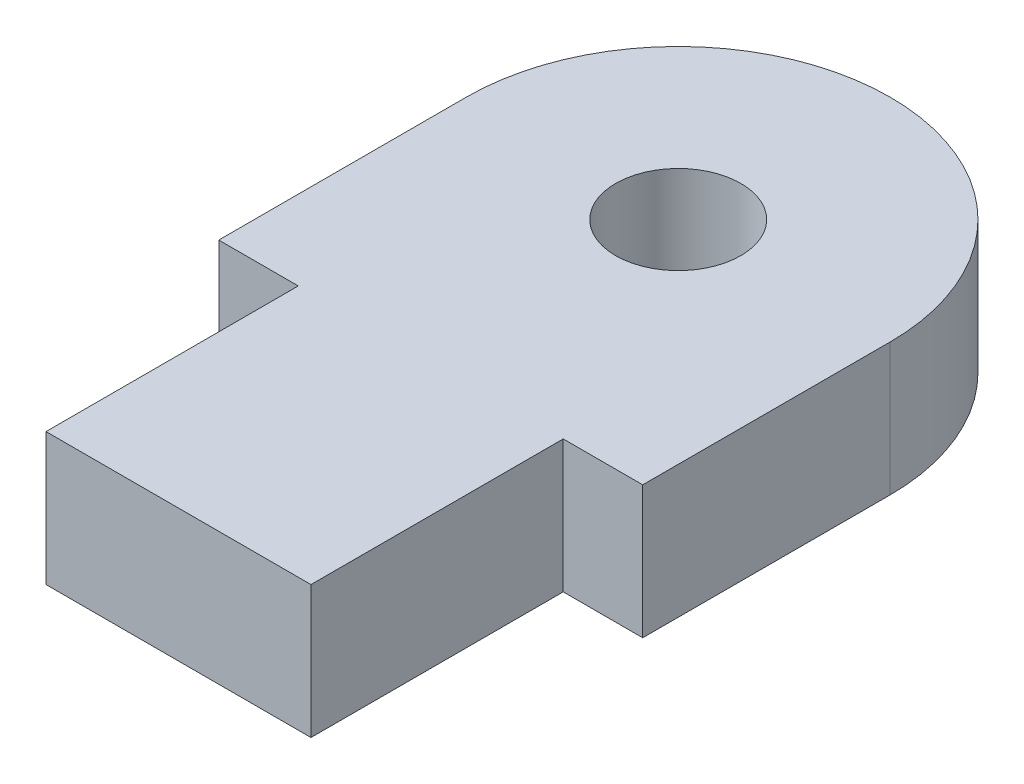
ISO-10303-21;
HEADER;
FILE_DESCRIPTION(('STEP AP214'),'2;1');
FILE_NAME('part.step','',(''),(''),'','','');
FILE_SCHEMA(('AUTOMOTIVE_DESIGN { 1 0 10303 214 1 1 1 1 }'));
ENDSEC;
DATA;
#1=APPLICATION_CONTEXT('core data for automotive mechanical design processes');
#2=APPLICATION_PROTOCOL_DEFINITION('international standard','automotive_design',2000,#1);
#3=PRODUCT_CONTEXT('',#1,'mechanical');
#4=PRODUCT('Part','Part','',(#3));
#5=PRODUCT_RELATED_PRODUCT_CATEGORY('part','',(#4));
#6=PRODUCT_DEFINITION_FORMATION('','',#4);
#7=PRODUCT_DEFINITION_CONTEXT('part definition',#1,'design');
#8=PRODUCT_DEFINITION('design','',#6,#7);
#9=PRODUCT_DEFINITION_SHAPE('','',#8);
#10=(LENGTH_UNIT() NAMED_UNIT(*) SI_UNIT(.MILLI.,.METRE.));
#11=(NAMED_UNIT(*) PLANE_ANGLE_UNIT() SI_UNIT($,.RADIAN.));
#12=(NAMED_UNIT(*) SI_UNIT($,.STERADIAN.) SOLID_ANGLE_UNIT());
#13=UNCERTAINTY_MEASURE_WITH_UNIT(LENGTH_MEASURE(1.E-05),#10,'distance_accuracy_value','');
#14=(GEOMETRIC_REPRESENTATION_CONTEXT(3) GLOBAL_UNCERTAINTY_ASSIGNED_CONTEXT((#13)) GLOBAL_UNIT_ASSIGNED_CONTEXT((#10,
#11,#12)) REPRESENTATION_CONTEXT('',''));
#15=CARTESIAN_POINT('',(0.,0.,0.));
#16=DIRECTION('',(0.,0.,1.));
#17=DIRECTION('',(1.,0.,0.));
#18=AXIS2_PLACEMENT_3D('',#15,#16,#17);
#19=CARTESIAN_POINT('',(0.,3.175,0.));
#20=DIRECTION('',(0.,1.,0.));
#21=DIRECTION('',(0.,0.,1.));
#22=AXIS2_PLACEMENT_3D('',#19,#20,#21);
#23=PLANE('',#22);
#24=DIRECTION('',(0.,0.,1.));
#25=VECTOR('',#24,1.);
#26=CARTESIAN_POINT('',(-3.175,3.175,5.9309));
#27=LINE('',#26,#25);
#28=CARTESIAN_POINT('',(-3.175,3.175,5.9309));
#29=VERTEX_POINT('',#28);
#30=CARTESIAN_POINT('',(-3.175,3.175,11.9761));
#31=VERTEX_POINT('',#30);
#32=EDGE_CURVE('E181',#29,#31,#27,.T.);
#33=ORIENTED_EDGE('',*,*,#32,.T.);
#34=DIRECTION('',(1.,0.,0.));
#35=VECTOR('',#34,1.);
#36=CARTESIAN_POINT('',(-3.175,3.175,11.9761));
#37=LINE('',#36,#35);
#38=CARTESIAN_POINT('',(3.175,3.175,11.9761));
#39=VERTEX_POINT('',#38);
#40=EDGE_CURVE('E114',#31,#39,#37,.T.);
#41=ORIENTED_EDGE('',*,*,#40,.T.);
#42=DIRECTION('',(0.,0.,-1.));
#43=VECTOR('',#42,1.);
#44=CARTESIAN_POINT('',(3.175,3.175,5.9309));
#45=LINE('',#44,#43);
#46=CARTESIAN_POINT('',(3.175,3.175,5.9309));
#47=VERTEX_POINT('',#46);
#48=EDGE_CURVE('E203',#39,#47,#45,.T.);
#49=ORIENTED_EDGE('',*,*,#48,.T.);
#50=DIRECTION('',(1.,0.,0.));
#51=VECTOR('',#50,1.);
#52=CARTESIAN_POINT('',(3.175,3.175,5.9309));
#53=LINE('',#52,#51);
#54=CARTESIAN_POINT('',(5.08,3.175,5.9309));
#55=VERTEX_POINT('',#54);
#56=EDGE_CURVE('E217',#47,#55,#53,.T.);
#57=ORIENTED_EDGE('',*,*,#56,.T.);
#58=DIRECTION('',(0.,0.,-1.));
#59=VECTOR('',#58,1.);
#60=CARTESIAN_POINT('',(5.08,3.175,5.9309));
#61=LINE('',#60,#59);
#62=CARTESIAN_POINT('',(5.08,3.175,0.));
#63=VERTEX_POINT('',#62);
#64=EDGE_CURVE('E136',#55,#63,#61,.T.);
#65=ORIENTED_EDGE('',*,*,#64,.T.);
#66=CARTESIAN_POINT('',(0.,3.175,0.));
#67=DIRECTION('',(0.,1.,0.));
#68=DIRECTION('',(0.,0.,1.));
#69=AXIS2_PLACEMENT_3D('',#66,#67,#68);
#70=CIRCLE('',#69,5.08);
#71=CARTESIAN_POINT('',(-5.08,3.175,0.));
#72=VERTEX_POINT('',#71);
#73=EDGE_CURVE('E130',#63,#72,#70,.T.);
#74=ORIENTED_EDGE('',*,*,#73,.T.);
#75=DIRECTION('',(0.,0.,1.));
#76=VECTOR('',#75,1.);
#77=CARTESIAN_POINT('',(-5.08,3.175,0.));
#78=LINE('',#77,#76);
#79=CARTESIAN_POINT('',(-5.08,3.175,5.9309));
#80=VERTEX_POINT('',#79);
#81=EDGE_CURVE('E134',#72,#80,#78,.T.);
#82=ORIENTED_EDGE('',*,*,#81,.T.);
#83=DIRECTION('',(1.,0.,0.));
#84=VECTOR('',#83,1.);
#85=CARTESIAN_POINT('',(-5.08,3.175,5.9309));
#86=LINE('',#85,#84);
#87=EDGE_CURVE('E61',#80,#29,#86,.T.);
#88=ORIENTED_EDGE('',*,*,#87,.T.);
#89=EDGE_LOOP('',(#33,#41,#49,#57,#65,#74,#82,#88));
#90=FACE_BOUND('',#89,.T.);
#91=CARTESIAN_POINT('',(0.,3.175,0.));
#92=DIRECTION('',(0.,1.,0.));
#93=DIRECTION('',(0.,0.,1.));
#94=AXIS2_PLACEMENT_3D('',#91,#92,#93);
#95=CIRCLE('',#94,1.5);
#96=CARTESIAN_POINT('',(0.,3.175,1.5));
#97=VERTEX_POINT('',#96);
#98=EDGE_CURVE('E163',#97,#97,#95,.T.);
#99=ORIENTED_EDGE('',*,*,#98,.F.);
#100=EDGE_LOOP('',(#99));
#101=FACE_BOUND('',#100,.T.);
#102=ADVANCED_FACE('F40',(#90,#101),#23,.T.);
#103=CARTESIAN_POINT('',(0.,0.,0.));
#104=DIRECTION('',(0.,1.,0.));
#105=DIRECTION('',(0.,0.,1.));
#106=AXIS2_PLACEMENT_3D('',#103,#104,#105);
#107=PLANE('',#106);
#108=DIRECTION('',(0.,0.,1.));
#109=VECTOR('',#108,1.);
#110=CARTESIAN_POINT('',(-3.175,0.,5.9309));
#111=LINE('',#110,#109);
#112=CARTESIAN_POINT('',(-3.175,0.,5.9309));
#113=VERTEX_POINT('',#112);
#114=CARTESIAN_POINT('',(-3.175,0.,11.9761));
#115=VERTEX_POINT('',#114);
#116=EDGE_CURVE('E158',#113,#115,#111,.T.);
#117=ORIENTED_EDGE('',*,*,#116,.F.);
#118=DIRECTION('',(1.,0.,0.));
#119=VECTOR('',#118,1.);
#120=CARTESIAN_POINT('',(-5.08,0.,5.9309));
#121=LINE('',#120,#119);
#122=CARTESIAN_POINT('',(-5.08,0.,5.9309));
#123=VERTEX_POINT('',#122);
#124=EDGE_CURVE('E105',#123,#113,#121,.T.);
#125=ORIENTED_EDGE('',*,*,#124,.F.);
#126=DIRECTION('',(0.,0.,1.));
#127=VECTOR('',#126,1.);
#128=CARTESIAN_POINT('',(-5.08,0.,0.));
#129=LINE('',#128,#127);
#130=CARTESIAN_POINT('',(-5.08,0.,0.));
#131=VERTEX_POINT('',#130);
#132=EDGE_CURVE('E98',#131,#123,#129,.T.);
#133=ORIENTED_EDGE('',*,*,#132,.F.);
#134=CARTESIAN_POINT('',(0.,0.,0.));
#135=DIRECTION('',(0.,1.,0.));
#136=DIRECTION('',(0.,0.,1.));
#137=AXIS2_PLACEMENT_3D('',#134,#135,#136);
#138=CIRCLE('',#137,5.08);
#139=CARTESIAN_POINT('',(5.08,0.,0.));
#140=VERTEX_POINT('',#139);
#141=EDGE_CURVE('E145',#140,#131,#138,.T.);
#142=ORIENTED_EDGE('',*,*,#141,.F.);
#143=DIRECTION('',(0.,0.,-1.));
#144=VECTOR('',#143,1.);
#145=CARTESIAN_POINT('',(5.08,0.,5.9309));
#146=LINE('',#145,#144);
#147=CARTESIAN_POINT('',(5.08,0.,5.9309));
#148=VERTEX_POINT('',#147);
#149=EDGE_CURVE('E172',#148,#140,#146,.T.);
#150=ORIENTED_EDGE('',*,*,#149,.F.);
#151=DIRECTION('',(1.,0.,0.));
#152=VECTOR('',#151,1.);
#153=CARTESIAN_POINT('',(3.175,0.,5.9309));
#154=LINE('',#153,#152);
#155=CARTESIAN_POINT('',(3.175,0.,5.9309));
#156=VERTEX_POINT('',#155);
#157=EDGE_CURVE('E169',#156,#148,#154,.T.);
#158=ORIENTED_EDGE('',*,*,#157,.F.);
#159=DIRECTION('',(0.,0.,-1.));
#160=VECTOR('',#159,1.);
#161=CARTESIAN_POINT('',(3.175,0.,5.9309));
#162=LINE('',#161,#160);
#163=CARTESIAN_POINT('',(3.175,0.,11.9761));
#164=VERTEX_POINT('',#163);
#165=EDGE_CURVE('E166',#164,#156,#162,.T.);
#166=ORIENTED_EDGE('',*,*,#165,.F.);
#167=DIRECTION('',(1.,0.,0.));
#168=VECTOR('',#167,1.);
#169=CARTESIAN_POINT('',(-3.175,0.,11.9761));
#170=LINE('',#169,#168);
#171=EDGE_CURVE('E162',#115,#164,#170,.T.);
#172=ORIENTED_EDGE('',*,*,#171,.F.);
#173=EDGE_LOOP('',(#117,#125,#133,#142,#150,#158,#166,#172));
#174=FACE_BOUND('',#173,.T.);
#175=CARTESIAN_POINT('',(0.,0.,0.));
#176=DIRECTION('',(0.,1.,0.));
#177=DIRECTION('',(0.,0.,1.));
#178=AXIS2_PLACEMENT_3D('',#175,#176,#177);
#179=CIRCLE('',#178,1.5);
#180=CARTESIAN_POINT('',(0.,0.,1.5));
#181=VERTEX_POINT('',#180);
#182=EDGE_CURVE('E226',#181,#181,#179,.T.);
#183=ORIENTED_EDGE('',*,*,#182,.T.);
#184=EDGE_LOOP('',(#183));
#185=FACE_BOUND('',#184,.T.);
#186=ADVANCED_FACE('F207',(#174,#185),#107,.F.);
#187=CARTESIAN_POINT('',(-3.175,3.175,5.9309));
#188=DIRECTION('',(1.,0.,0.));
#189=DIRECTION('',(0.,0.,-1.));
#190=AXIS2_PLACEMENT_3D('',#187,#188,#189);
#191=PLANE('',#190);
#192=ORIENTED_EDGE('',*,*,#116,.T.);
#193=DIRECTION('',(0.,-1.,0.));
#194=VECTOR('',#193,1.);
#195=CARTESIAN_POINT('',(-3.175,3.175,11.9761));
#196=LINE('',#195,#194);
#197=EDGE_CURVE('E11',#31,#115,#196,.T.);
#198=ORIENTED_EDGE('',*,*,#197,.F.);
#199=ORIENTED_EDGE('',*,*,#32,.F.);
#200=DIRECTION('',(0.,-1.,0.));
#201=VECTOR('',#200,1.);
#202=CARTESIAN_POINT('',(-3.175,3.175,5.9309));
#203=LINE('',#202,#201);
#204=EDGE_CURVE('E154',#29,#113,#203,.T.);
#205=ORIENTED_EDGE('',*,*,#204,.T.);
#206=EDGE_LOOP('',(#192,#198,#199,#205));
#207=FACE_BOUND('',#206,.T.);
#208=ADVANCED_FACE('F42',(#207),#191,.F.);
#209=CARTESIAN_POINT('',(-3.175,3.175,11.9761));
#210=DIRECTION('',(0.,0.,-1.));
#211=DIRECTION('',(-1.,0.,0.));
#212=AXIS2_PLACEMENT_3D('',#209,#210,#211);
#213=PLANE('',#212);
#214=ORIENTED_EDGE('',*,*,#171,.T.);
#215=DIRECTION('',(0.,-1.,0.));
#216=VECTOR('',#215,1.);
#217=CARTESIAN_POINT('',(3.175,3.175,11.9761));
#218=LINE('',#217,#216);
#219=EDGE_CURVE('E50',#39,#164,#218,.T.);
#220=ORIENTED_EDGE('',*,*,#219,.F.);
#221=ORIENTED_EDGE('',*,*,#40,.F.);
#222=ORIENTED_EDGE('',*,*,#197,.T.);
#223=EDGE_LOOP('',(#214,#220,#221,#222));
#224=FACE_BOUND('',#223,.T.);
#225=ADVANCED_FACE('F256',(#224),#213,.F.);
#226=CARTESIAN_POINT('',(3.175,3.175,5.9309));
#227=DIRECTION('',(-1.,0.,0.));
#228=DIRECTION('',(0.,0.,1.));
#229=AXIS2_PLACEMENT_3D('',#226,#227,#228);
#230=PLANE('',#229);
#231=ORIENTED_EDGE('',*,*,#165,.T.);
#232=DIRECTION('',(0.,-1.,0.));
#233=VECTOR('',#232,1.);
#234=CARTESIAN_POINT('',(3.175,3.175,5.9309));
#235=LINE('',#234,#233);
#236=EDGE_CURVE('E192',#47,#156,#235,.T.);
#237=ORIENTED_EDGE('',*,*,#236,.F.);
#238=ORIENTED_EDGE('',*,*,#48,.F.);
#239=ORIENTED_EDGE('',*,*,#219,.T.);
#240=EDGE_LOOP('',(#231,#237,#238,#239));
#241=FACE_BOUND('',#240,.T.);
#242=ADVANCED_FACE('F201',(#241),#230,.F.);
#243=CARTESIAN_POINT('',(3.175,3.175,5.9309));
#244=DIRECTION('',(0.,0.,-1.));
#245=DIRECTION('',(-1.,0.,0.));
#246=AXIS2_PLACEMENT_3D('',#243,#244,#245);
#247=PLANE('',#246);
#248=ORIENTED_EDGE('',*,*,#157,.T.);
#249=DIRECTION('',(0.,-1.,0.));
#250=VECTOR('',#249,1.);
#251=CARTESIAN_POINT('',(5.08,3.175,5.9309));
#252=LINE('',#251,#250);
#253=EDGE_CURVE('E188',#55,#148,#252,.T.);
#254=ORIENTED_EDGE('',*,*,#253,.F.);
#255=ORIENTED_EDGE('',*,*,#56,.F.);
#256=ORIENTED_EDGE('',*,*,#236,.T.);
#257=EDGE_LOOP('',(#248,#254,#255,#256));
#258=FACE_BOUND('',#257,.T.);
#259=ADVANCED_FACE('F212',(#258),#247,.F.);
#260=CARTESIAN_POINT('',(5.08,3.175,5.9309));
#261=DIRECTION('',(-1.,0.,0.));
#262=DIRECTION('',(0.,0.,1.));
#263=AXIS2_PLACEMENT_3D('',#260,#261,#262);
#264=PLANE('',#263);
#265=ORIENTED_EDGE('',*,*,#149,.T.);
#266=DIRECTION('',(0.,-1.,0.));
#267=VECTOR('',#266,1.);
#268=CARTESIAN_POINT('',(5.08,3.175,0.));
#269=LINE('',#268,#267);
#270=EDGE_CURVE('E147',#63,#140,#269,.T.);
#271=ORIENTED_EDGE('',*,*,#270,.F.);
#272=ORIENTED_EDGE('',*,*,#64,.F.);
#273=ORIENTED_EDGE('',*,*,#253,.T.);
#274=EDGE_LOOP('',(#265,#271,#272,#273));
#275=FACE_BOUND('',#274,.T.);
#276=ADVANCED_FACE('F215',(#275),#264,.F.);
#277=CARTESIAN_POINT('',(0.,3.175,0.));
#278=DIRECTION('',(0.,-1.,0.));
#279=DIRECTION('',(0.,0.,-1.));
#280=AXIS2_PLACEMENT_3D('',#277,#278,#279);
#281=CYLINDRICAL_SURFACE('',#280,5.08);
#282=ORIENTED_EDGE('',*,*,#141,.T.);
#283=DIRECTION('',(0.,-1.,0.));
#284=VECTOR('',#283,1.);
#285=CARTESIAN_POINT('',(-5.08,3.175,0.));
#286=LINE('',#285,#284);
#287=EDGE_CURVE('E142',#72,#131,#286,.T.);
#288=ORIENTED_EDGE('',*,*,#287,.F.);
#289=ORIENTED_EDGE('',*,*,#73,.F.);
#290=ORIENTED_EDGE('',*,*,#270,.T.);
#291=EDGE_LOOP('',(#282,#288,#289,#290));
#292=FACE_BOUND('',#291,.T.);
#293=ADVANCED_FACE('F143',(#292),#281,.T.);
#294=CARTESIAN_POINT('',(-5.08,3.175,0.));
#295=DIRECTION('',(1.,0.,0.));
#296=DIRECTION('',(0.,0.,-1.));
#297=AXIS2_PLACEMENT_3D('',#294,#295,#296);
#298=PLANE('',#297);
#299=ORIENTED_EDGE('',*,*,#132,.T.);
#300=DIRECTION('',(0.,-1.,0.));
#301=VECTOR('',#300,1.);
#302=CARTESIAN_POINT('',(-5.08,3.175,5.9309));
#303=LINE('',#302,#301);
#304=EDGE_CURVE('E148',#80,#123,#303,.T.);
#305=ORIENTED_EDGE('',*,*,#304,.F.);
#306=ORIENTED_EDGE('',*,*,#81,.F.);
#307=ORIENTED_EDGE('',*,*,#287,.T.);
#308=EDGE_LOOP('',(#299,#305,#306,#307));
#309=FACE_BOUND('',#308,.T.);
#310=ADVANCED_FACE('F150',(#309),#298,.F.);
#311=CARTESIAN_POINT('',(-5.08,3.175,5.9309));
#312=DIRECTION('',(0.,0.,-1.));
#313=DIRECTION('',(-1.,0.,0.));
#314=AXIS2_PLACEMENT_3D('',#311,#312,#313);
#315=PLANE('',#314);
#316=ORIENTED_EDGE('',*,*,#124,.T.);
#317=ORIENTED_EDGE('',*,*,#204,.F.);
#318=ORIENTED_EDGE('',*,*,#87,.F.);
#319=ORIENTED_EDGE('',*,*,#304,.T.);
#320=EDGE_LOOP('',(#316,#317,#318,#319));
#321=FACE_BOUND('',#320,.T.);
#322=ADVANCED_FACE('F244',(#321),#315,.F.);
#323=CARTESIAN_POINT('',(0.,3.175,0.));
#324=DIRECTION('',(0.,-1.,0.));
#325=DIRECTION('',(0.,0.,-1.));
#326=AXIS2_PLACEMENT_3D('',#323,#324,#325);
#327=CYLINDRICAL_SURFACE('',#326,1.5);
#328=ORIENTED_EDGE('',*,*,#98,.T.);
#329=EDGE_LOOP('',(#328));
#330=FACE_BOUND('',#329,.T.);
#331=ORIENTED_EDGE('',*,*,#182,.F.);
#332=EDGE_LOOP('',(#331));
#333=FACE_BOUND('',#332,.T.);
#334=ADVANCED_FACE('F234',(#330,#333),#327,.F.);
#335=CLOSED_SHELL('',(#102,#186,#208,#225,#242,#259,#276,#293,#310,#322,#334));
#336=MANIFOLD_SOLID_BREP('B2',#335);
#337=ADVANCED_BREP_SHAPE_REPRESENTATION('',(#18,#336),#14);
#338=SHAPE_DEFINITION_REPRESENTATION(#9,#337);
ENDSEC;
END-ISO-10303-21;
